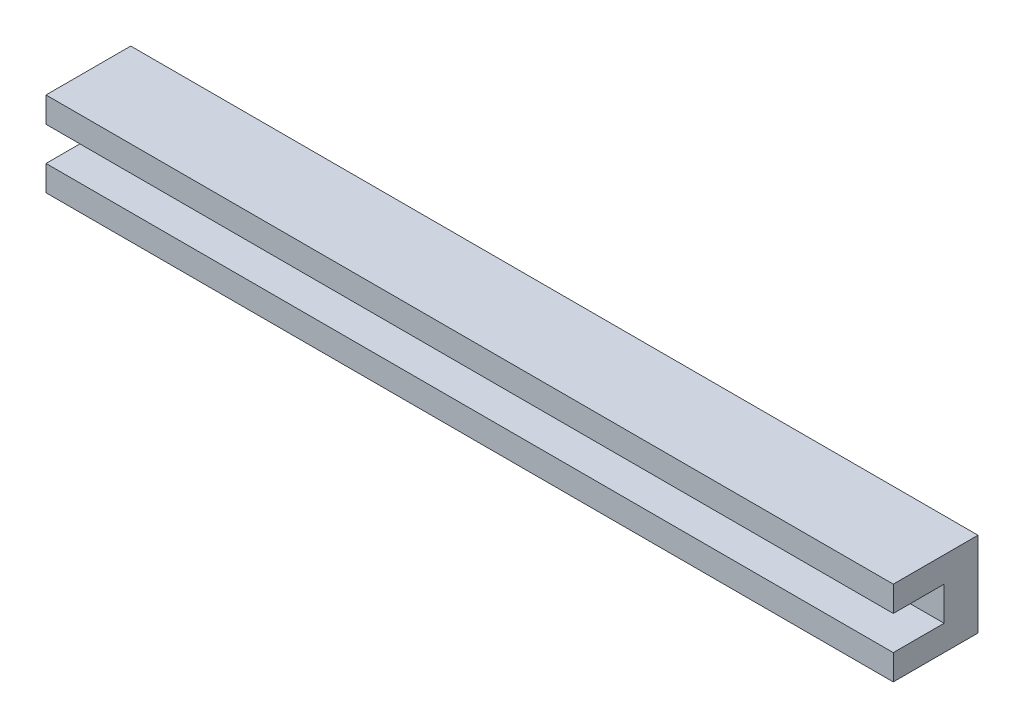
ISO-10303-21;
HEADER;
FILE_DESCRIPTION(('STEP AP214'),'2;1');
FILE_NAME('part.step','',(''),(''),'','','');
FILE_SCHEMA(('AUTOMOTIVE_DESIGN { 1 0 10303 214 1 1 1 1 }'));
ENDSEC;
DATA;
#1=APPLICATION_CONTEXT('core data for automotive mechanical design processes');
#2=APPLICATION_PROTOCOL_DEFINITION('international standard','automotive_design',2000,#1);
#3=PRODUCT_CONTEXT('',#1,'mechanical');
#4=PRODUCT('Part','Part','',(#3));
#5=PRODUCT_RELATED_PRODUCT_CATEGORY('part','',(#4));
#6=PRODUCT_DEFINITION_FORMATION('','',#4);
#7=PRODUCT_DEFINITION_CONTEXT('part definition',#1,'design');
#8=PRODUCT_DEFINITION('design','',#6,#7);
#9=PRODUCT_DEFINITION_SHAPE('','',#8);
#10=(LENGTH_UNIT() NAMED_UNIT(*) SI_UNIT(.MILLI.,.METRE.));
#11=(NAMED_UNIT(*) PLANE_ANGLE_UNIT() SI_UNIT($,.RADIAN.));
#12=(NAMED_UNIT(*) SI_UNIT($,.STERADIAN.) SOLID_ANGLE_UNIT());
#13=UNCERTAINTY_MEASURE_WITH_UNIT(LENGTH_MEASURE(1.E-05),#10,'distance_accuracy_value','');
#14=(GEOMETRIC_REPRESENTATION_CONTEXT(3) GLOBAL_UNCERTAINTY_ASSIGNED_CONTEXT((#13)) GLOBAL_UNIT_ASSIGNED_CONTEXT((#10,
#11,#12)) REPRESENTATION_CONTEXT('',''));
#15=CARTESIAN_POINT('',(0.,0.,0.));
#16=DIRECTION('',(0.,0.,1.));
#17=DIRECTION('',(1.,0.,0.));
#18=AXIS2_PLACEMENT_3D('',#15,#16,#17);
#19=CARTESIAN_POINT('',(-48.9767580864635,20.9973176300204,4.));
#20=DIRECTION('',(1.,0.,0.));
#21=DIRECTION('',(0.,1.,0.));
#22=AXIS2_PLACEMENT_3D('',#19,#20,#21);
#23=PLANE('',#22);
#24=DIRECTION('',(0.,-1.,0.));
#25=VECTOR('',#24,1.);
#26=CARTESIAN_POINT('',(-48.9767580864635,20.9973176300204,0.));
#27=LINE('',#26,#25);
#28=CARTESIAN_POINT('',(-48.9767580864635,20.9973176300204,0.));
#29=VERTEX_POINT('',#28);
#30=CARTESIAN_POINT('',(-48.9767580864635,10.9973176300204,0.));
#31=VERTEX_POINT('',#30);
#32=EDGE_CURVE('E128',#29,#31,#27,.T.);
#33=ORIENTED_EDGE('',*,*,#32,.T.);
#34=DIRECTION('',(0.,0.,-1.));
#35=VECTOR('',#34,1.);
#36=CARTESIAN_POINT('',(-48.9767580864635,10.9973176300204,4.));
#37=LINE('',#36,#35);
#38=CARTESIAN_POINT('',(-48.9767580864635,10.9973176300204,10.));
#39=VERTEX_POINT('',#38);
#40=EDGE_CURVE('E11',#39,#31,#37,.T.);
#41=ORIENTED_EDGE('',*,*,#40,.F.);
#42=DIRECTION('',(0.,-1.,0.));
#43=VECTOR('',#42,1.);
#44=CARTESIAN_POINT('',(-48.9767580864635,10.9973176300204,10.));
#45=LINE('',#44,#43);
#46=CARTESIAN_POINT('',(-48.9767580864635,13.9973176300204,10.));
#47=VERTEX_POINT('',#46);
#48=EDGE_CURVE('E142',#47,#39,#45,.T.);
#49=ORIENTED_EDGE('',*,*,#48,.F.);
#50=DIRECTION('',(0.,0.,-1.));
#51=VECTOR('',#50,1.);
#52=CARTESIAN_POINT('',(-48.9767580864635,13.9973176300204,10.));
#53=LINE('',#52,#51);
#54=CARTESIAN_POINT('',(-48.9767580864635,13.9973176300204,4.));
#55=VERTEX_POINT('',#54);
#56=EDGE_CURVE('E138',#47,#55,#53,.T.);
#57=ORIENTED_EDGE('',*,*,#56,.T.);
#58=DIRECTION('',(0.,-1.,0.));
#59=VECTOR('',#58,1.);
#60=CARTESIAN_POINT('',(-48.9767580864635,20.9973176300204,4.));
#61=LINE('',#60,#59);
#62=CARTESIAN_POINT('',(-48.9767580864635,17.9973176300204,4.));
#63=VERTEX_POINT('',#62);
#64=EDGE_CURVE('E127',#63,#55,#61,.T.);
#65=ORIENTED_EDGE('',*,*,#64,.F.);
#66=DIRECTION('',(0.,0.,-1.));
#67=VECTOR('',#66,1.);
#68=CARTESIAN_POINT('',(-48.9767580864635,17.9973176300204,10.));
#69=LINE('',#68,#67);
#70=CARTESIAN_POINT('',(-48.9767580864635,17.9973176300204,10.));
#71=VERTEX_POINT('',#70);
#72=EDGE_CURVE('E108',#71,#63,#69,.T.);
#73=ORIENTED_EDGE('',*,*,#72,.F.);
#74=DIRECTION('',(0.,-1.,0.));
#75=VECTOR('',#74,1.);
#76=CARTESIAN_POINT('',(-48.9767580864635,20.9973176300204,10.));
#77=LINE('',#76,#75);
#78=CARTESIAN_POINT('',(-48.9767580864635,20.9973176300204,10.));
#79=VERTEX_POINT('',#78);
#80=EDGE_CURVE('E115',#79,#71,#77,.T.);
#81=ORIENTED_EDGE('',*,*,#80,.F.);
#82=DIRECTION('',(0.,0.,-1.));
#83=VECTOR('',#82,1.);
#84=CARTESIAN_POINT('',(-48.9767580864635,20.9973176300204,4.));
#85=LINE('',#84,#83);
#86=EDGE_CURVE('E154',#79,#29,#85,.T.);
#87=ORIENTED_EDGE('',*,*,#86,.T.);
#88=EDGE_LOOP('',(#33,#41,#49,#57,#65,#73,#81,#87));
#89=FACE_BOUND('',#88,.T.);
#90=ADVANCED_FACE('F41',(#89),#23,.F.);
#91=CARTESIAN_POINT('',(-48.9767580864635,10.9973176300204,4.));
#92=DIRECTION('',(0.,1.,0.));
#93=DIRECTION('',(0.,0.,1.));
#94=AXIS2_PLACEMENT_3D('',#91,#92,#93);
#95=PLANE('',#94);
#96=DIRECTION('',(1.,0.,0.));
#97=VECTOR('',#96,1.);
#98=CARTESIAN_POINT('',(-48.9767580864635,10.9973176300204,0.));
#99=LINE('',#98,#97);
#100=CARTESIAN_POINT('',(51.0232419135365,10.9973176300204,0.));
#101=VERTEX_POINT('',#100);
#102=EDGE_CURVE('E130',#31,#101,#99,.T.);
#103=ORIENTED_EDGE('',*,*,#102,.T.);
#104=DIRECTION('',(0.,0.,-1.));
#105=VECTOR('',#104,1.);
#106=CARTESIAN_POINT('',(51.0232419135365,10.9973176300204,4.));
#107=LINE('',#106,#105);
#108=CARTESIAN_POINT('',(51.0232419135365,10.9973176300204,10.));
#109=VERTEX_POINT('',#108);
#110=EDGE_CURVE('E48',#109,#101,#107,.T.);
#111=ORIENTED_EDGE('',*,*,#110,.F.);
#112=DIRECTION('',(1.,0.,0.));
#113=VECTOR('',#112,1.);
#114=CARTESIAN_POINT('',(-48.9767580864635,10.9973176300204,10.));
#115=LINE('',#114,#113);
#116=EDGE_CURVE('E146',#39,#109,#115,.T.);
#117=ORIENTED_EDGE('',*,*,#116,.F.);
#118=ORIENTED_EDGE('',*,*,#40,.T.);
#119=EDGE_LOOP('',(#103,#111,#117,#118));
#120=FACE_BOUND('',#119,.T.);
#121=ADVANCED_FACE('F178',(#120),#95,.F.);
#122=CARTESIAN_POINT('',(51.0232419135365,20.9973176300204,4.));
#123=DIRECTION('',(-1.,0.,0.));
#124=DIRECTION('',(0.,0.,1.));
#125=AXIS2_PLACEMENT_3D('',#122,#123,#124);
#126=PLANE('',#125);
#127=DIRECTION('',(0.,1.,0.));
#128=VECTOR('',#127,1.);
#129=CARTESIAN_POINT('',(51.0232419135365,20.9973176300204,0.));
#130=LINE('',#129,#128);
#131=CARTESIAN_POINT('',(51.0232419135365,20.9973176300204,0.));
#132=VERTEX_POINT('',#131);
#133=EDGE_CURVE('E157',#101,#132,#130,.T.);
#134=ORIENTED_EDGE('',*,*,#133,.T.);
#135=DIRECTION('',(0.,0.,-1.));
#136=VECTOR('',#135,1.);
#137=CARTESIAN_POINT('',(51.0232419135365,20.9973176300204,4.));
#138=LINE('',#137,#136);
#139=CARTESIAN_POINT('',(51.0232419135365,20.9973176300204,10.));
#140=VERTEX_POINT('',#139);
#141=EDGE_CURVE('E161',#140,#132,#138,.T.);
#142=ORIENTED_EDGE('',*,*,#141,.F.);
#143=DIRECTION('',(0.,1.,0.));
#144=VECTOR('',#143,1.);
#145=CARTESIAN_POINT('',(51.0232419135365,20.9973176300204,10.));
#146=LINE('',#145,#144);
#147=CARTESIAN_POINT('',(51.0232419135365,17.9973176300204,10.));
#148=VERTEX_POINT('',#147);
#149=EDGE_CURVE('E114',#148,#140,#146,.T.);
#150=ORIENTED_EDGE('',*,*,#149,.F.);
#151=DIRECTION('',(0.,0.,-1.));
#152=VECTOR('',#151,1.);
#153=CARTESIAN_POINT('',(51.0232419135365,17.9973176300204,10.));
#154=LINE('',#153,#152);
#155=CARTESIAN_POINT('',(51.0232419135365,17.9973176300204,4.));
#156=VERTEX_POINT('',#155);
#157=EDGE_CURVE('E110',#148,#156,#154,.T.);
#158=ORIENTED_EDGE('',*,*,#157,.T.);
#159=DIRECTION('',(0.,1.,0.));
#160=VECTOR('',#159,1.);
#161=CARTESIAN_POINT('',(51.0232419135365,20.9973176300204,4.));
#162=LINE('',#161,#160);
#163=CARTESIAN_POINT('',(51.0232419135365,13.9973176300204,4.));
#164=VERTEX_POINT('',#163);
#165=EDGE_CURVE('E152',#164,#156,#162,.T.);
#166=ORIENTED_EDGE('',*,*,#165,.F.);
#167=DIRECTION('',(0.,0.,-1.));
#168=VECTOR('',#167,1.);
#169=CARTESIAN_POINT('',(51.0232419135365,13.9973176300204,10.));
#170=LINE('',#169,#168);
#171=CARTESIAN_POINT('',(51.0232419135365,13.9973176300204,10.));
#172=VERTEX_POINT('',#171);
#173=EDGE_CURVE('E135',#172,#164,#170,.T.);
#174=ORIENTED_EDGE('',*,*,#173,.F.);
#175=DIRECTION('',(0.,1.,0.));
#176=VECTOR('',#175,1.);
#177=CARTESIAN_POINT('',(51.0232419135365,10.9973176300204,10.));
#178=LINE('',#177,#176);
#179=EDGE_CURVE('E144',#109,#172,#178,.T.);
#180=ORIENTED_EDGE('',*,*,#179,.F.);
#181=ORIENTED_EDGE('',*,*,#110,.T.);
#182=EDGE_LOOP('',(#134,#142,#150,#158,#166,#174,#180,#181));
#183=FACE_BOUND('',#182,.T.);
#184=ADVANCED_FACE('F167',(#183),#126,.F.);
#185=CARTESIAN_POINT('',(-48.9767580864635,20.9973176300204,4.));
#186=DIRECTION('',(0.,-1.,0.));
#187=DIRECTION('',(0.,0.,-1.));
#188=AXIS2_PLACEMENT_3D('',#185,#186,#187);
#189=PLANE('',#188);
#190=DIRECTION('',(-1.,0.,0.));
#191=VECTOR('',#190,1.);
#192=CARTESIAN_POINT('',(-48.9767580864635,20.9973176300204,0.));
#193=LINE('',#192,#191);
#194=EDGE_CURVE('E153',#132,#29,#193,.T.);
#195=ORIENTED_EDGE('',*,*,#194,.T.);
#196=ORIENTED_EDGE('',*,*,#86,.F.);
#197=DIRECTION('',(-1.,0.,0.));
#198=VECTOR('',#197,1.);
#199=CARTESIAN_POINT('',(-48.9767580864635,20.9973176300204,10.));
#200=LINE('',#199,#198);
#201=EDGE_CURVE('E121',#140,#79,#200,.T.);
#202=ORIENTED_EDGE('',*,*,#201,.F.);
#203=ORIENTED_EDGE('',*,*,#141,.T.);
#204=EDGE_LOOP('',(#195,#196,#202,#203));
#205=FACE_BOUND('',#204,.T.);
#206=ADVANCED_FACE('F176',(#205),#189,.F.);
#207=CARTESIAN_POINT('',(0.,0.,4.));
#208=DIRECTION('',(0.,0.,1.));
#209=DIRECTION('',(1.,0.,0.));
#210=AXIS2_PLACEMENT_3D('',#207,#208,#209);
#211=PLANE('',#210);
#212=DIRECTION('',(1.,0.,0.));
#213=VECTOR('',#212,1.);
#214=CARTESIAN_POINT('',(-48.9767580864635,17.9973176300204,4.));
#215=LINE('',#214,#213);
#216=EDGE_CURVE('E60',#63,#156,#215,.T.);
#217=ORIENTED_EDGE('',*,*,#216,.F.);
#218=ORIENTED_EDGE('',*,*,#64,.T.);
#219=DIRECTION('',(-1.,0.,0.));
#220=VECTOR('',#219,1.);
#221=CARTESIAN_POINT('',(-48.9767580864635,13.9973176300204,4.));
#222=LINE('',#221,#220);
#223=EDGE_CURVE('E55',#164,#55,#222,.T.);
#224=ORIENTED_EDGE('',*,*,#223,.F.);
#225=ORIENTED_EDGE('',*,*,#165,.T.);
#226=EDGE_LOOP('',(#217,#218,#224,#225));
#227=FACE_BOUND('',#226,.T.);
#228=ADVANCED_FACE('F185',(#227),#211,.T.);
#229=CARTESIAN_POINT('',(0.,0.,0.));
#230=DIRECTION('',(0.,0.,1.));
#231=DIRECTION('',(1.,0.,0.));
#232=AXIS2_PLACEMENT_3D('',#229,#230,#231);
#233=PLANE('',#232);
#234=ORIENTED_EDGE('',*,*,#32,.F.);
#235=ORIENTED_EDGE('',*,*,#194,.F.);
#236=ORIENTED_EDGE('',*,*,#133,.F.);
#237=ORIENTED_EDGE('',*,*,#102,.F.);
#238=EDGE_LOOP('',(#234,#235,#236,#237));
#239=FACE_BOUND('',#238,.T.);
#240=ADVANCED_FACE('F174',(#239),#233,.F.);
#241=CARTESIAN_POINT('',(-48.9767580864635,13.9973176300204,10.));
#242=DIRECTION('',(0.,-1.,0.));
#243=DIRECTION('',(0.,0.,-1.));
#244=AXIS2_PLACEMENT_3D('',#241,#242,#243);
#245=PLANE('',#244);
#246=ORIENTED_EDGE('',*,*,#223,.T.);
#247=ORIENTED_EDGE('',*,*,#56,.F.);
#248=DIRECTION('',(-1.,0.,0.));
#249=VECTOR('',#248,1.);
#250=CARTESIAN_POINT('',(-48.9767580864635,13.9973176300204,10.));
#251=LINE('',#250,#249);
#252=EDGE_CURVE('E140',#172,#47,#251,.T.);
#253=ORIENTED_EDGE('',*,*,#252,.F.);
#254=ORIENTED_EDGE('',*,*,#173,.T.);
#255=EDGE_LOOP('',(#246,#247,#253,#254));
#256=FACE_BOUND('',#255,.T.);
#257=ADVANCED_FACE('F184',(#256),#245,.F.);
#258=CARTESIAN_POINT('',(0.,0.,10.));
#259=DIRECTION('',(0.,0.,-1.));
#260=DIRECTION('',(-1.,0.,0.));
#261=AXIS2_PLACEMENT_3D('',#258,#259,#260);
#262=PLANE('',#261);
#263=ORIENTED_EDGE('',*,*,#48,.T.);
#264=ORIENTED_EDGE('',*,*,#116,.T.);
#265=ORIENTED_EDGE('',*,*,#179,.T.);
#266=ORIENTED_EDGE('',*,*,#252,.T.);
#267=EDGE_LOOP('',(#263,#264,#265,#266));
#268=FACE_BOUND('',#267,.T.);
#269=ADVANCED_FACE('F180',(#268),#262,.F.);
#270=CARTESIAN_POINT('',(-48.9767580864635,17.9973176300204,10.));
#271=DIRECTION('',(0.,1.,0.));
#272=DIRECTION('',(0.,0.,1.));
#273=AXIS2_PLACEMENT_3D('',#270,#271,#272);
#274=PLANE('',#273);
#275=ORIENTED_EDGE('',*,*,#216,.T.);
#276=ORIENTED_EDGE('',*,*,#157,.F.);
#277=DIRECTION('',(1.,0.,0.));
#278=VECTOR('',#277,1.);
#279=CARTESIAN_POINT('',(-48.9767580864635,17.9973176300204,10.));
#280=LINE('',#279,#278);
#281=EDGE_CURVE('E104',#71,#148,#280,.T.);
#282=ORIENTED_EDGE('',*,*,#281,.F.);
#283=ORIENTED_EDGE('',*,*,#72,.T.);
#284=EDGE_LOOP('',(#275,#276,#282,#283));
#285=FACE_BOUND('',#284,.T.);
#286=ADVANCED_FACE('F106',(#285),#274,.F.);
#287=CARTESIAN_POINT('',(0.,0.,10.));
#288=DIRECTION('',(0.,0.,1.));
#289=DIRECTION('',(1.,0.,0.));
#290=AXIS2_PLACEMENT_3D('',#287,#288,#289);
#291=PLANE('',#290);
#292=ORIENTED_EDGE('',*,*,#80,.T.);
#293=ORIENTED_EDGE('',*,*,#281,.T.);
#294=ORIENTED_EDGE('',*,*,#149,.T.);
#295=ORIENTED_EDGE('',*,*,#201,.T.);
#296=EDGE_LOOP('',(#292,#293,#294,#295));
#297=FACE_BOUND('',#296,.T.);
#298=ADVANCED_FACE('F119',(#297),#291,.T.);
#299=CLOSED_SHELL('',(#90,#121,#184,#206,#228,#240,#257,#269,#286,#298));
#300=MANIFOLD_SOLID_BREP('B2',#299);
#301=ADVANCED_BREP_SHAPE_REPRESENTATION('',(#18,#300),#14);
#302=SHAPE_DEFINITION_REPRESENTATION(#9,#301);
ENDSEC;
END-ISO-10303-21;
